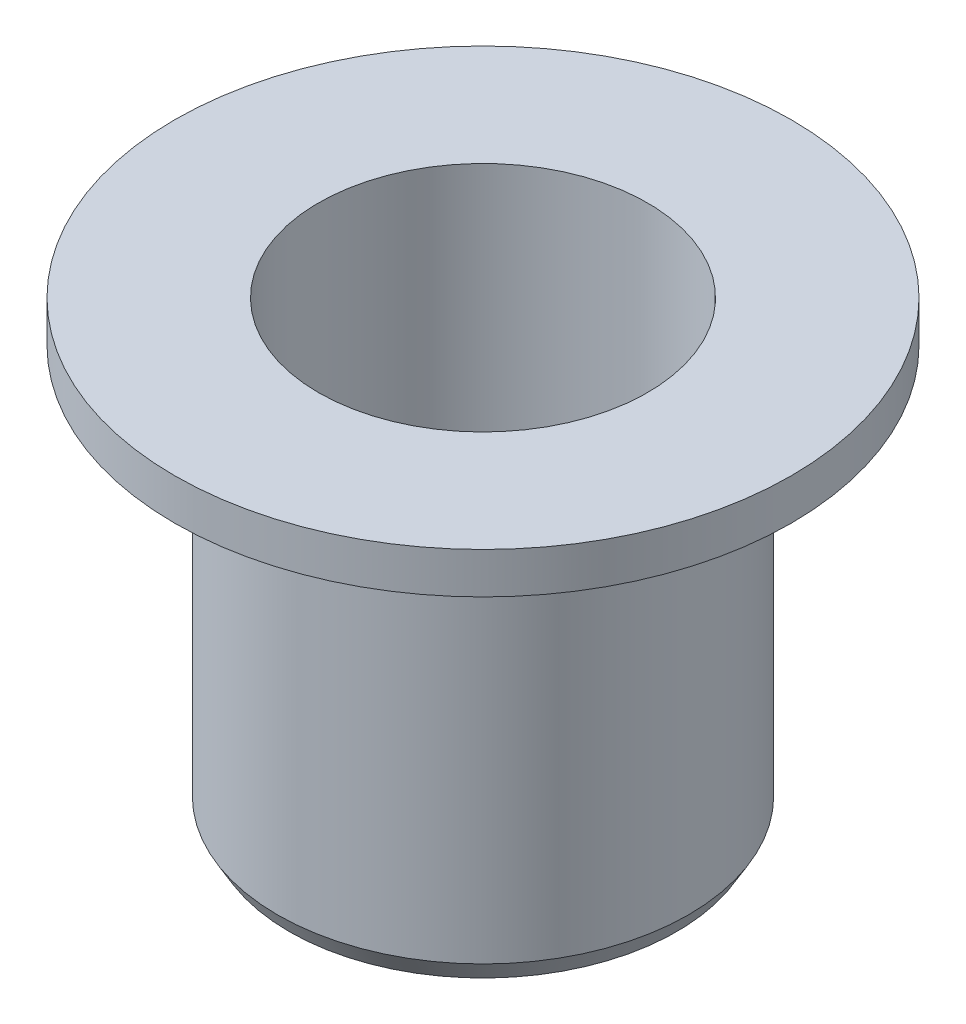
ISO-10303-21;
HEADER;
FILE_DESCRIPTION(('STEP AP214'),'2;1');
FILE_NAME('part.step','',(''),(''),'','','');
FILE_SCHEMA(('AUTOMOTIVE_DESIGN { 1 0 10303 214 1 1 1 1 }'));
ENDSEC;
DATA;
#1=APPLICATION_CONTEXT('core data for automotive mechanical design processes');
#2=APPLICATION_PROTOCOL_DEFINITION('international standard','automotive_design',2000,#1);
#3=PRODUCT_CONTEXT('',#1,'mechanical');
#4=PRODUCT('Part','Part','',(#3));
#5=PRODUCT_RELATED_PRODUCT_CATEGORY('part','',(#4));
#6=PRODUCT_DEFINITION_FORMATION('','',#4);
#7=PRODUCT_DEFINITION_CONTEXT('part definition',#1,'design');
#8=PRODUCT_DEFINITION('design','',#6,#7);
#9=PRODUCT_DEFINITION_SHAPE('','',#8);
#10=(LENGTH_UNIT() NAMED_UNIT(*) SI_UNIT(.MILLI.,.METRE.));
#11=(NAMED_UNIT(*) PLANE_ANGLE_UNIT() SI_UNIT($,.RADIAN.));
#12=(NAMED_UNIT(*) SI_UNIT($,.STERADIAN.) SOLID_ANGLE_UNIT());
#13=UNCERTAINTY_MEASURE_WITH_UNIT(LENGTH_MEASURE(1.E-05),#10,'distance_accuracy_value','');
#14=(GEOMETRIC_REPRESENTATION_CONTEXT(3) GLOBAL_UNCERTAINTY_ASSIGNED_CONTEXT((#13)) GLOBAL_UNIT_ASSIGNED_CONTEXT((#10,
#11,#12)) REPRESENTATION_CONTEXT('',''));
#15=CARTESIAN_POINT('',(0.,0.,0.));
#16=DIRECTION('',(0.,0.,1.));
#17=DIRECTION('',(1.,0.,0.));
#18=AXIS2_PLACEMENT_3D('',#15,#16,#17);
#19=CARTESIAN_POINT('',(-4.,0.,0.));
#20=DIRECTION('',(0.,1.,0.));
#21=DIRECTION('',(0.,0.,1.));
#22=AXIS2_PLACEMENT_3D('',#19,#20,#21);
#23=PLANE('',#22);
#24=CARTESIAN_POINT('',(0.,0.,0.));
#25=DIRECTION('',(0.,1.,0.));
#26=DIRECTION('',(0.,0.,1.));
#27=AXIS2_PLACEMENT_3D('',#24,#25,#26);
#28=CIRCLE('',#27,7.5);
#29=CARTESIAN_POINT('',(0.,0.,7.5));
#30=VERTEX_POINT('',#29);
#31=EDGE_CURVE('E76',#30,#30,#28,.T.);
#32=ORIENTED_EDGE('',*,*,#31,.T.);
#33=EDGE_LOOP('',(#32));
#34=FACE_BOUND('',#33,.T.);
#35=CARTESIAN_POINT('',(0.,0.,0.));
#36=DIRECTION('',(0.,1.,0.));
#37=DIRECTION('',(0.,0.,1.));
#38=AXIS2_PLACEMENT_3D('',#35,#36,#37);
#39=CIRCLE('',#38,4.);
#40=CARTESIAN_POINT('',(0.,0.,4.));
#41=VERTEX_POINT('',#40);
#42=EDGE_CURVE('E10',#41,#41,#39,.T.);
#43=ORIENTED_EDGE('',*,*,#42,.F.);
#44=EDGE_LOOP('',(#43));
#45=FACE_BOUND('',#44,.T.);
#46=ADVANCED_FACE('F39',(#34,#45),#23,.T.);
#47=CARTESIAN_POINT('',(0.,0.,0.));
#48=DIRECTION('',(0.,1.,0.));
#49=DIRECTION('',(0.,0.,1.));
#50=AXIS2_PLACEMENT_3D('',#47,#48,#49);
#51=CYLINDRICAL_SURFACE('',#50,4.);
#52=ORIENTED_EDGE('',*,*,#42,.T.);
#53=EDGE_LOOP('',(#52));
#54=FACE_BOUND('',#53,.T.);
#55=CARTESIAN_POINT('',(0.,-11.,0.));
#56=DIRECTION('',(0.,1.,0.));
#57=DIRECTION('',(0.,0.,1.));
#58=AXIS2_PLACEMENT_3D('',#55,#56,#57);
#59=CIRCLE('',#58,4.);
#60=CARTESIAN_POINT('',(0.,-11.,4.));
#61=VERTEX_POINT('',#60);
#62=EDGE_CURVE('E46',#61,#61,#59,.T.);
#63=ORIENTED_EDGE('',*,*,#62,.F.);
#64=EDGE_LOOP('',(#63));
#65=FACE_BOUND('',#64,.T.);
#66=ADVANCED_FACE('F96',(#54,#65),#51,.F.);
#67=CARTESIAN_POINT('',(-4.71132486540518,-11.,0.));
#68=DIRECTION('',(0.,-1.,0.));
#69=DIRECTION('',(0.,0.,-1.));
#70=AXIS2_PLACEMENT_3D('',#67,#68,#69);
#71=PLANE('',#70);
#72=ORIENTED_EDGE('',*,*,#62,.T.);
#73=EDGE_LOOP('',(#72));
#74=FACE_BOUND('',#73,.T.);
#75=CARTESIAN_POINT('',(0.,-11.,0.));
#76=DIRECTION('',(0.,1.,0.));
#77=DIRECTION('',(0.,0.,1.));
#78=AXIS2_PLACEMENT_3D('',#75,#76,#77);
#79=CIRCLE('',#78,4.71132486540518);
#80=CARTESIAN_POINT('',(0.,-11.,4.71132486540518));
#81=VERTEX_POINT('',#80);
#82=EDGE_CURVE('E52',#81,#81,#79,.T.);
#83=ORIENTED_EDGE('',*,*,#82,.F.);
#84=EDGE_LOOP('',(#83));
#85=FACE_BOUND('',#84,.T.);
#86=ADVANCED_FACE('F100',(#74,#85),#71,.T.);
#87=CARTESIAN_POINT('',(0.,-10.5,0.));
#88=DIRECTION('',(0.,1.,0.));
#89=DIRECTION('',(0.,0.,1.));
#90=AXIS2_PLACEMENT_3D('',#87,#88,#89);
#91=CONICAL_SURFACE('',#90,5.,0.5235987755983);
#92=ORIENTED_EDGE('',*,*,#82,.T.);
#93=EDGE_LOOP('',(#92));
#94=FACE_BOUND('',#93,.T.);
#95=CARTESIAN_POINT('',(0.,-10.5,0.));
#96=DIRECTION('',(0.,1.,0.));
#97=DIRECTION('',(0.,0.,1.));
#98=AXIS2_PLACEMENT_3D('',#95,#96,#97);
#99=CIRCLE('',#98,5.);
#100=CARTESIAN_POINT('',(0.,-10.5,5.));
#101=VERTEX_POINT('',#100);
#102=EDGE_CURVE('E58',#101,#101,#99,.T.);
#103=ORIENTED_EDGE('',*,*,#102,.F.);
#104=EDGE_LOOP('',(#103));
#105=FACE_BOUND('',#104,.T.);
#106=ADVANCED_FACE('F104',(#94,#105),#91,.T.);
#107=CARTESIAN_POINT('',(0.,0.,0.));
#108=DIRECTION('',(0.,1.,0.));
#109=DIRECTION('',(0.,0.,1.));
#110=AXIS2_PLACEMENT_3D('',#107,#108,#109);
#111=CYLINDRICAL_SURFACE('',#110,5.);
#112=ORIENTED_EDGE('',*,*,#102,.T.);
#113=EDGE_LOOP('',(#112));
#114=FACE_BOUND('',#113,.T.);
#115=CARTESIAN_POINT('',(0.,-1.5,0.));
#116=DIRECTION('',(0.,1.,0.));
#117=DIRECTION('',(0.,0.,1.));
#118=AXIS2_PLACEMENT_3D('',#115,#116,#117);
#119=CIRCLE('',#118,5.);
#120=CARTESIAN_POINT('',(0.,-1.5,5.));
#121=VERTEX_POINT('',#120);
#122=EDGE_CURVE('E64',#121,#121,#119,.T.);
#123=ORIENTED_EDGE('',*,*,#122,.F.);
#124=EDGE_LOOP('',(#123));
#125=FACE_BOUND('',#124,.T.);
#126=ADVANCED_FACE('F110',(#114,#125),#111,.T.);
#127=CARTESIAN_POINT('',(0.,-1.5,0.));
#128=DIRECTION('',(0.,1.,0.));
#129=DIRECTION('',(0.,0.,1.));
#130=AXIS2_PLACEMENT_3D('',#127,#128,#129);
#131=TOROIDAL_SURFACE('',#130,5.5,0.5);
#132=ORIENTED_EDGE('',*,*,#122,.T.);
#133=EDGE_LOOP('',(#132));
#134=FACE_BOUND('',#133,.T.);
#135=CARTESIAN_POINT('',(0.,-1.,0.));
#136=DIRECTION('',(0.,1.,0.));
#137=DIRECTION('',(0.,0.,1.));
#138=AXIS2_PLACEMENT_3D('',#135,#136,#137);
#139=CIRCLE('',#138,5.5);
#140=CARTESIAN_POINT('',(0.,-1.,5.5));
#141=VERTEX_POINT('',#140);
#142=EDGE_CURVE('E68',#141,#141,#139,.T.);
#143=ORIENTED_EDGE('',*,*,#142,.F.);
#144=EDGE_LOOP('',(#143));
#145=FACE_BOUND('',#144,.T.);
#146=ADVANCED_FACE('F92',(#134,#145),#131,.F.);
#147=CARTESIAN_POINT('',(-7.5,-1.,0.));
#148=DIRECTION('',(0.,-1.,0.));
#149=DIRECTION('',(0.,0.,-1.));
#150=AXIS2_PLACEMENT_3D('',#147,#148,#149);
#151=PLANE('',#150);
#152=ORIENTED_EDGE('',*,*,#142,.T.);
#153=EDGE_LOOP('',(#152));
#154=FACE_BOUND('',#153,.T.);
#155=CARTESIAN_POINT('',(0.,-1.,0.));
#156=DIRECTION('',(0.,1.,0.));
#157=DIRECTION('',(0.,0.,1.));
#158=AXIS2_PLACEMENT_3D('',#155,#156,#157);
#159=CIRCLE('',#158,7.5);
#160=CARTESIAN_POINT('',(0.,-1.,7.5));
#161=VERTEX_POINT('',#160);
#162=EDGE_CURVE('E72',#161,#161,#159,.T.);
#163=ORIENTED_EDGE('',*,*,#162,.F.);
#164=EDGE_LOOP('',(#163));
#165=FACE_BOUND('',#164,.T.);
#166=ADVANCED_FACE('F86',(#154,#165),#151,.T.);
#167=CARTESIAN_POINT('',(0.,0.,0.));
#168=DIRECTION('',(0.,1.,0.));
#169=DIRECTION('',(0.,0.,1.));
#170=AXIS2_PLACEMENT_3D('',#167,#168,#169);
#171=CYLINDRICAL_SURFACE('',#170,7.5);
#172=ORIENTED_EDGE('',*,*,#162,.T.);
#173=EDGE_LOOP('',(#172));
#174=FACE_BOUND('',#173,.T.);
#175=ORIENTED_EDGE('',*,*,#31,.F.);
#176=EDGE_LOOP('',(#175));
#177=FACE_BOUND('',#176,.T.);
#178=ADVANCED_FACE('F84',(#174,#177),#171,.T.);
#179=CLOSED_SHELL('',(#46,#66,#86,#106,#126,#146,#166,#178));
#180=MANIFOLD_SOLID_BREP('B2',#179);
#181=ADVANCED_BREP_SHAPE_REPRESENTATION('',(#18,#180),#14);
#182=SHAPE_DEFINITION_REPRESENTATION(#9,#181);
ENDSEC;
END-ISO-10303-21;
